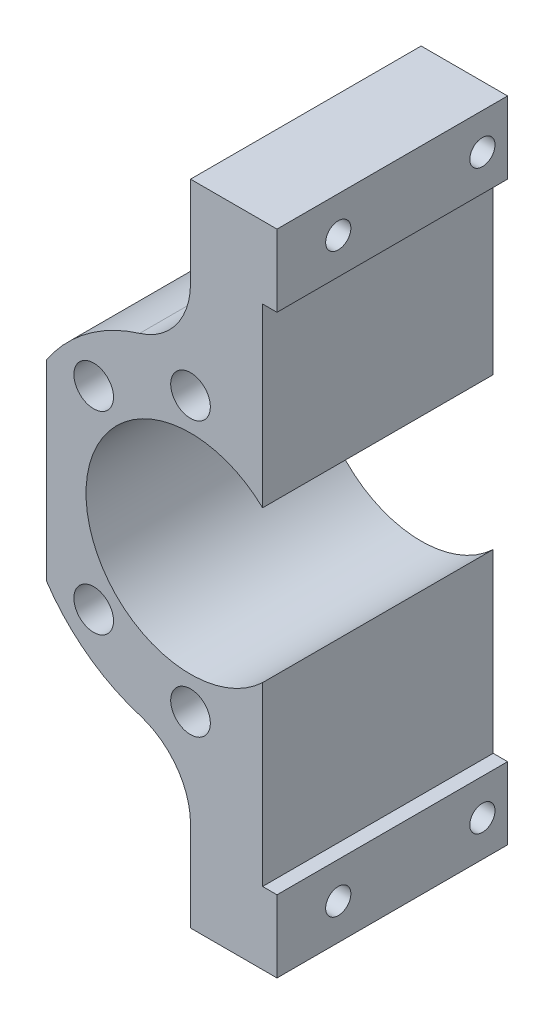
ISO-10303-21;
HEADER;
FILE_DESCRIPTION(('STEP AP214'),'2;1');
FILE_NAME('part.step','',(''),(''),'','','');
FILE_SCHEMA(('AUTOMOTIVE_DESIGN { 1 0 10303 214 1 1 1 1 }'));
ENDSEC;
DATA;
#1=APPLICATION_CONTEXT('core data for automotive mechanical design processes');
#2=APPLICATION_PROTOCOL_DEFINITION('international standard','automotive_design',2000,#1);
#3=PRODUCT_CONTEXT('',#1,'mechanical');
#4=PRODUCT('Part','Part','',(#3));
#5=PRODUCT_RELATED_PRODUCT_CATEGORY('part','',(#4));
#6=PRODUCT_DEFINITION_FORMATION('','',#4);
#7=PRODUCT_DEFINITION_CONTEXT('part definition',#1,'design');
#8=PRODUCT_DEFINITION('design','',#6,#7);
#9=PRODUCT_DEFINITION_SHAPE('','',#8);
#10=(LENGTH_UNIT() NAMED_UNIT(*) SI_UNIT(.MILLI.,.METRE.));
#11=(NAMED_UNIT(*) PLANE_ANGLE_UNIT() SI_UNIT($,.RADIAN.));
#12=(NAMED_UNIT(*) SI_UNIT($,.STERADIAN.) SOLID_ANGLE_UNIT());
#13=UNCERTAINTY_MEASURE_WITH_UNIT(LENGTH_MEASURE(1.E-05),#10,'distance_accuracy_value','');
#14=(GEOMETRIC_REPRESENTATION_CONTEXT(3) GLOBAL_UNCERTAINTY_ASSIGNED_CONTEXT((#13)) GLOBAL_UNIT_ASSIGNED_CONTEXT((#10,
#11,#12)) REPRESENTATION_CONTEXT('',''));
#15=CARTESIAN_POINT('',(0.,0.,0.));
#16=DIRECTION('',(0.,0.,1.));
#17=DIRECTION('',(1.,0.,0.));
#18=AXIS2_PLACEMENT_3D('',#15,#16,#17);
#19=CARTESIAN_POINT('',(7.61347886785544,-11.7092581325979,32.));
#20=DIRECTION('',(-1.,0.,0.));
#21=DIRECTION('',(0.,-1.,0.));
#22=AXIS2_PLACEMENT_3D('',#19,#20,#21);
#23=PLANE('',#22);
#24=DIRECTION('',(0.,0.,1.));
#25=VECTOR('',#24,1.);
#26=CARTESIAN_POINT('',(7.61347886785544,-36.2092581325979,32.));
#27=LINE('',#26,#25);
#28=CARTESIAN_POINT('',(7.61347886785544,-36.2092581325979,0.));
#29=VERTEX_POINT('',#28);
#30=CARTESIAN_POINT('',(7.61347886785544,-36.2092581325979,32.));
#31=VERTEX_POINT('',#30);
#32=EDGE_CURVE('E184',#29,#31,#27,.T.);
#33=ORIENTED_EDGE('',*,*,#32,.F.);
#34=DIRECTION('',(0.,1.,0.));
#35=VECTOR('',#34,1.);
#36=CARTESIAN_POINT('',(7.61347886785544,-11.7092581325979,0.));
#37=LINE('',#36,#35);
#38=CARTESIAN_POINT('',(7.61347886785544,-11.7092581325979,0.));
#39=VERTEX_POINT('',#38);
#40=EDGE_CURVE('E345',#29,#39,#37,.T.);
#41=ORIENTED_EDGE('',*,*,#40,.T.);
#42=DIRECTION('',(0.,0.,-1.));
#43=VECTOR('',#42,1.);
#44=CARTESIAN_POINT('',(7.61347886785544,-11.7092581325979,32.));
#45=LINE('',#44,#43);
#46=CARTESIAN_POINT('',(7.61347886785544,-11.7092581325979,32.));
#47=VERTEX_POINT('',#46);
#48=EDGE_CURVE('E356',#47,#39,#45,.T.);
#49=ORIENTED_EDGE('',*,*,#48,.F.);
#50=DIRECTION('',(0.,1.,0.));
#51=VECTOR('',#50,1.);
#52=CARTESIAN_POINT('',(7.61347886785544,-11.7092581325979,32.));
#53=LINE('',#52,#51);
#54=EDGE_CURVE('E325',#31,#47,#53,.T.);
#55=ORIENTED_EDGE('',*,*,#54,.F.);
#56=EDGE_LOOP('',(#33,#41,#49,#55));
#57=FACE_BOUND('',#56,.T.);
#58=ADVANCED_FACE('F41',(#57),#23,.F.);
#59=CARTESIAN_POINT('',(7.61347886785543,9.29074186740205,32.));
#60=DIRECTION('',(-1.,0.,0.));
#61=DIRECTION('',(0.,-1.,0.));
#62=AXIS2_PLACEMENT_3D('',#59,#60,#61);
#63=PLANE('',#62);
#64=DIRECTION('',(0.,0.,-1.));
#65=VECTOR('',#64,1.);
#66=CARTESIAN_POINT('',(7.61347886785543,33.790741867402,32.));
#67=LINE('',#66,#65);
#68=CARTESIAN_POINT('',(7.61347886785543,33.790741867402,32.));
#69=VERTEX_POINT('',#68);
#70=CARTESIAN_POINT('',(7.61347886785543,33.790741867402,0.));
#71=VERTEX_POINT('',#70);
#72=EDGE_CURVE('E212',#69,#71,#67,.T.);
#73=ORIENTED_EDGE('',*,*,#72,.F.);
#74=DIRECTION('',(0.,1.,0.));
#75=VECTOR('',#74,1.);
#76=CARTESIAN_POINT('',(7.61347886785543,9.29074186740205,32.));
#77=LINE('',#76,#75);
#78=CARTESIAN_POINT('',(7.61347886785543,9.29074186740205,32.));
#79=VERTEX_POINT('',#78);
#80=EDGE_CURVE('E331',#79,#69,#77,.T.);
#81=ORIENTED_EDGE('',*,*,#80,.F.);
#82=DIRECTION('',(0.,0.,-1.));
#83=VECTOR('',#82,1.);
#84=CARTESIAN_POINT('',(7.61347886785543,9.29074186740205,32.));
#85=LINE('',#84,#83);
#86=CARTESIAN_POINT('',(7.61347886785543,9.29074186740205,0.));
#87=VERTEX_POINT('',#86);
#88=EDGE_CURVE('E335',#79,#87,#85,.T.);
#89=ORIENTED_EDGE('',*,*,#88,.T.);
#90=DIRECTION('',(0.,1.,0.));
#91=VECTOR('',#90,1.);
#92=CARTESIAN_POINT('',(7.61347886785543,9.29074186740205,0.));
#93=LINE('',#92,#91);
#94=EDGE_CURVE('E318',#87,#71,#93,.T.);
#95=ORIENTED_EDGE('',*,*,#94,.T.);
#96=EDGE_LOOP('',(#73,#81,#89,#95));
#97=FACE_BOUND('',#96,.T.);
#98=ADVANCED_FACE('F432',(#97),#63,.F.);
#99=CARTESIAN_POINT('',(-2.38652113214456,-1.20925813259795,32.));
#100=DIRECTION('',(0.,0.,-1.));
#101=DIRECTION('',(-1.,0.,0.));
#102=AXIS2_PLACEMENT_3D('',#99,#100,#101);
#103=PLANE('',#102);
#104=DIRECTION('',(0.,-1.,0.));
#105=VECTOR('',#104,1.);
#106=CARTESIAN_POINT('',(-2.38652113214456,22.790741867402,32.));
#107=LINE('',#106,#105);
#108=CARTESIAN_POINT('',(-2.38652113214457,43.790741867402,32.));
#109=VERTEX_POINT('',#108);
#110=CARTESIAN_POINT('',(-2.38652113214456,31.2868954859459,32.));
#111=VERTEX_POINT('',#110);
#112=EDGE_CURVE('E251',#109,#111,#107,.T.);
#113=ORIENTED_EDGE('',*,*,#112,.T.);
#114=CARTESIAN_POINT('',(-12.3865211321446,31.2868954859459,32.));
#115=DIRECTION('',(0.,0.,-1.));
#116=DIRECTION('',(-1.,0.,0.));
#117=AXIS2_PLACEMENT_3D('',#114,#115,#116);
#118=CIRCLE('',#117,10.);
#119=CARTESIAN_POINT('',(-9.44534466155633,21.7292032451977,32.));
#120=VERTEX_POINT('',#119);
#121=EDGE_CURVE('E11',#111,#120,#118,.T.);
#122=ORIENTED_EDGE('',*,*,#121,.T.);
#123=CARTESIAN_POINT('',(-2.38652113214456,-1.20925813259795,32.));
#124=DIRECTION('',(0.,0.,1.));
#125=DIRECTION('',(-1.,0.,0.));
#126=AXIS2_PLACEMENT_3D('',#123,#124,#125);
#127=CIRCLE('',#126,24.);
#128=CARTESIAN_POINT('',(-22.3865211321446,12.0572410288236,32.));
#129=VERTEX_POINT('',#128);
#130=EDGE_CURVE('E314',#120,#129,#127,.T.);
#131=ORIENTED_EDGE('',*,*,#130,.T.);
#132=DIRECTION('',(0.,-1.,0.));
#133=VECTOR('',#132,1.);
#134=CARTESIAN_POINT('',(-22.3865211321446,12.0572410288236,32.));
#135=LINE('',#134,#133);
#136=CARTESIAN_POINT('',(-22.3865211321446,-14.4757572940195,32.));
#137=VERTEX_POINT('',#136);
#138=EDGE_CURVE('E317',#129,#137,#135,.T.);
#139=ORIENTED_EDGE('',*,*,#138,.T.);
#140=CARTESIAN_POINT('',(-2.38652113214456,-1.20925813259795,32.));
#141=DIRECTION('',(0.,0.,1.));
#142=DIRECTION('',(1.,0.,0.));
#143=AXIS2_PLACEMENT_3D('',#140,#141,#142);
#144=CIRCLE('',#143,24.);
#145=CARTESIAN_POINT('',(-9.44534466155632,-24.1477195103936,32.));
#146=VERTEX_POINT('',#145);
#147=EDGE_CURVE('E321',#137,#146,#144,.T.);
#148=ORIENTED_EDGE('',*,*,#147,.T.);
#149=CARTESIAN_POINT('',(-12.3865211321446,-33.7054117511418,32.));
#150=DIRECTION('',(0.,0.,-1.));
#151=DIRECTION('',(-1.,0.,0.));
#152=AXIS2_PLACEMENT_3D('',#149,#150,#151);
#153=CIRCLE('',#152,10.);
#154=CARTESIAN_POINT('',(-2.38652113214456,-33.7054117511418,32.));
#155=VERTEX_POINT('',#154);
#156=EDGE_CURVE('E384',#146,#155,#153,.T.);
#157=ORIENTED_EDGE('',*,*,#156,.T.);
#158=DIRECTION('',(0.,-1.,0.));
#159=VECTOR('',#158,1.);
#160=CARTESIAN_POINT('',(-2.38652113214456,-25.209258132598,32.));
#161=LINE('',#160,#159);
#162=CARTESIAN_POINT('',(-2.38652113214455,-46.209258132598,32.));
#163=VERTEX_POINT('',#162);
#164=EDGE_CURVE('E162',#155,#163,#161,.T.);
#165=ORIENTED_EDGE('',*,*,#164,.T.);
#166=DIRECTION('',(1.,0.,0.));
#167=VECTOR('',#166,1.);
#168=CARTESIAN_POINT('',(-2.38652113214455,-46.209258132598,32.));
#169=LINE('',#168,#167);
#170=CARTESIAN_POINT('',(9.61347886785544,-46.209258132598,32.));
#171=VERTEX_POINT('',#170);
#172=EDGE_CURVE('E154',#163,#171,#169,.T.);
#173=ORIENTED_EDGE('',*,*,#172,.T.);
#174=DIRECTION('',(0.,-1.,0.));
#175=VECTOR('',#174,1.);
#176=CARTESIAN_POINT('',(9.61347886785544,-46.209258132598,32.));
#177=LINE('',#176,#175);
#178=CARTESIAN_POINT('',(9.61347886785544,-36.2092581325979,32.));
#179=VERTEX_POINT('',#178);
#180=EDGE_CURVE('E160',#179,#171,#177,.T.);
#181=ORIENTED_EDGE('',*,*,#180,.F.);
#182=DIRECTION('',(-1.,0.,0.));
#183=VECTOR('',#182,1.);
#184=CARTESIAN_POINT('',(9.61347886785544,-36.2092581325979,32.));
#185=LINE('',#184,#183);
#186=EDGE_CURVE('E196',#179,#31,#185,.T.);
#187=ORIENTED_EDGE('',*,*,#186,.T.);
#188=ORIENTED_EDGE('',*,*,#54,.T.);
#189=CARTESIAN_POINT('',(-2.38652113214456,-1.20925813259795,32.));
#190=DIRECTION('',(0.,0.,-1.));
#191=DIRECTION('',(-1.,0.,0.));
#192=AXIS2_PLACEMENT_3D('',#189,#190,#191);
#193=CIRCLE('',#192,14.5);
#194=EDGE_CURVE('E328',#47,#79,#193,.T.);
#195=ORIENTED_EDGE('',*,*,#194,.T.);
#196=ORIENTED_EDGE('',*,*,#80,.T.);
#197=DIRECTION('',(-1.,0.,0.));
#198=VECTOR('',#197,1.);
#199=CARTESIAN_POINT('',(9.61347886785543,33.790741867402,32.));
#200=LINE('',#199,#198);
#201=CARTESIAN_POINT('',(9.61347886785543,33.790741867402,32.));
#202=VERTEX_POINT('',#201);
#203=EDGE_CURVE('E235',#202,#69,#200,.T.);
#204=ORIENTED_EDGE('',*,*,#203,.F.);
#205=DIRECTION('',(0.,-1.,0.));
#206=VECTOR('',#205,1.);
#207=CARTESIAN_POINT('',(9.61347886785543,43.790741867402,32.));
#208=LINE('',#207,#206);
#209=CARTESIAN_POINT('',(9.61347886785543,43.790741867402,32.));
#210=VERTEX_POINT('',#209);
#211=EDGE_CURVE('E213',#210,#202,#208,.T.);
#212=ORIENTED_EDGE('',*,*,#211,.F.);
#213=DIRECTION('',(1.,0.,0.));
#214=VECTOR('',#213,1.);
#215=CARTESIAN_POINT('',(-2.38652113214457,43.790741867402,32.));
#216=LINE('',#215,#214);
#217=EDGE_CURVE('E257',#109,#210,#216,.T.);
#218=ORIENTED_EDGE('',*,*,#217,.F.);
#219=EDGE_LOOP('',(#113,#122,#131,#139,#148,#157,#165,#173,#181,#187,#188,#195,#196,#204,#212,#218));
#220=FACE_BOUND('',#219,.T.);
#221=CARTESIAN_POINT('',(-2.38652113214456,17.7907418674021,32.));
#222=DIRECTION('',(0.,0.,1.));
#223=DIRECTION('',(1.,0.,0.));
#224=AXIS2_PLACEMENT_3D('',#221,#222,#223);
#225=CIRCLE('',#224,2.75);
#226=CARTESIAN_POINT('',(0.363478867855439,17.7907418674021,32.));
#227=VERTEX_POINT('',#226);
#228=EDGE_CURVE('E306',#227,#227,#225,.T.);
#229=ORIENTED_EDGE('',*,*,#228,.F.);
#230=EDGE_LOOP('',(#229));
#231=FACE_BOUND('',#230,.T.);
#232=CARTESIAN_POINT('',(-15.821549974689,12.2257707099464,32.));
#233=DIRECTION('',(0.,0.,1.));
#234=DIRECTION('',(1.,0.,0.));
#235=AXIS2_PLACEMENT_3D('',#232,#233,#234);
#236=CIRCLE('',#235,2.75);
#237=CARTESIAN_POINT('',(-13.071549974689,12.2257707099464,32.));
#238=VERTEX_POINT('',#237);
#239=EDGE_CURVE('E298',#238,#238,#236,.T.);
#240=ORIENTED_EDGE('',*,*,#239,.F.);
#241=EDGE_LOOP('',(#240));
#242=FACE_BOUND('',#241,.T.);
#243=CARTESIAN_POINT('',(-2.38652113214456,-20.2092581325979,32.));
#244=DIRECTION('',(0.,0.,1.));
#245=DIRECTION('',(1.,0.,0.));
#246=AXIS2_PLACEMENT_3D('',#243,#244,#245);
#247=CIRCLE('',#246,2.75);
#248=CARTESIAN_POINT('',(0.363478867855441,-20.2092581325979,32.));
#249=VERTEX_POINT('',#248);
#250=EDGE_CURVE('E290',#249,#249,#247,.T.);
#251=ORIENTED_EDGE('',*,*,#250,.F.);
#252=EDGE_LOOP('',(#251));
#253=FACE_BOUND('',#252,.T.);
#254=CARTESIAN_POINT('',(-15.821549974689,-14.6442869751423,32.));
#255=DIRECTION('',(0.,0.,1.));
#256=DIRECTION('',(1.,0.,0.));
#257=AXIS2_PLACEMENT_3D('',#254,#255,#256);
#258=CIRCLE('',#257,2.75);
#259=CARTESIAN_POINT('',(-13.071549974689,-14.6442869751423,32.));
#260=VERTEX_POINT('',#259);
#261=EDGE_CURVE('E282',#260,#260,#258,.T.);
#262=ORIENTED_EDGE('',*,*,#261,.F.);
#263=EDGE_LOOP('',(#262));
#264=FACE_BOUND('',#263,.T.);
#265=ADVANCED_FACE('F156',(#220,#231,#242,#253,#264),#103,.F.);
#266=CARTESIAN_POINT('',(-2.38652113214456,-1.20925813259795,0.));
#267=DIRECTION('',(0.,0.,-1.));
#268=DIRECTION('',(-1.,0.,0.));
#269=AXIS2_PLACEMENT_3D('',#266,#267,#268);
#270=PLANE('',#269);
#271=CARTESIAN_POINT('',(-2.38652113214456,-20.2092581325979,0.));
#272=DIRECTION('',(0.,0.,1.));
#273=DIRECTION('',(1.,0.,0.));
#274=AXIS2_PLACEMENT_3D('',#271,#272,#273);
#275=CIRCLE('',#274,2.75);
#276=CARTESIAN_POINT('',(0.363478867855441,-20.2092581325979,0.));
#277=VERTEX_POINT('',#276);
#278=EDGE_CURVE('E286',#277,#277,#275,.T.);
#279=ORIENTED_EDGE('',*,*,#278,.T.);
#280=EDGE_LOOP('',(#279));
#281=FACE_BOUND('',#280,.T.);
#282=CARTESIAN_POINT('',(-2.38652113214456,17.7907418674021,0.));
#283=DIRECTION('',(0.,0.,1.));
#284=DIRECTION('',(1.,0.,0.));
#285=AXIS2_PLACEMENT_3D('',#282,#283,#284);
#286=CIRCLE('',#285,2.75);
#287=CARTESIAN_POINT('',(0.363478867855439,17.7907418674021,0.));
#288=VERTEX_POINT('',#287);
#289=EDGE_CURVE('E302',#288,#288,#286,.T.);
#290=ORIENTED_EDGE('',*,*,#289,.T.);
#291=EDGE_LOOP('',(#290));
#292=FACE_BOUND('',#291,.T.);
#293=CARTESIAN_POINT('',(-2.38652113214456,-1.20925813259795,0.));
#294=DIRECTION('',(0.,0.,1.));
#295=DIRECTION('',(-1.,0.,0.));
#296=AXIS2_PLACEMENT_3D('',#293,#294,#295);
#297=CIRCLE('',#296,24.);
#298=CARTESIAN_POINT('',(-9.44534466155633,21.7292032451977,0.));
#299=VERTEX_POINT('',#298);
#300=CARTESIAN_POINT('',(-22.3865211321446,12.0572410288236,0.));
#301=VERTEX_POINT('',#300);
#302=EDGE_CURVE('E310',#299,#301,#297,.T.);
#303=ORIENTED_EDGE('',*,*,#302,.F.);
#304=CARTESIAN_POINT('',(-12.3865211321446,31.2868954859459,0.));
#305=DIRECTION('',(0.,0.,-1.));
#306=DIRECTION('',(-1.,0.,0.));
#307=AXIS2_PLACEMENT_3D('',#304,#305,#306);
#308=CIRCLE('',#307,10.);
#309=CARTESIAN_POINT('',(-2.38652113214456,31.2868954859459,0.));
#310=VERTEX_POINT('',#309);
#311=EDGE_CURVE('E50',#299,#310,#308,.F.);
#312=ORIENTED_EDGE('',*,*,#311,.T.);
#313=DIRECTION('',(0.,1.,0.));
#314=VECTOR('',#313,1.);
#315=CARTESIAN_POINT('',(-2.38652113214457,43.790741867402,0.));
#316=LINE('',#315,#314);
#317=CARTESIAN_POINT('',(-2.38652113214457,43.790741867402,0.));
#318=VERTEX_POINT('',#317);
#319=EDGE_CURVE('E254',#310,#318,#316,.T.);
#320=ORIENTED_EDGE('',*,*,#319,.T.);
#321=DIRECTION('',(1.,0.,0.));
#322=VECTOR('',#321,1.);
#323=CARTESIAN_POINT('',(-2.38652113214457,43.790741867402,0.));
#324=LINE('',#323,#322);
#325=CARTESIAN_POINT('',(9.61347886785543,43.790741867402,0.));
#326=VERTEX_POINT('',#325);
#327=EDGE_CURVE('E258',#318,#326,#324,.T.);
#328=ORIENTED_EDGE('',*,*,#327,.T.);
#329=DIRECTION('',(0.,1.,0.));
#330=VECTOR('',#329,1.);
#331=CARTESIAN_POINT('',(9.61347886785543,43.790741867402,0.));
#332=LINE('',#331,#330);
#333=CARTESIAN_POINT('',(9.61347886785543,33.790741867402,0.));
#334=VERTEX_POINT('',#333);
#335=EDGE_CURVE('E220',#334,#326,#332,.T.);
#336=ORIENTED_EDGE('',*,*,#335,.F.);
#337=DIRECTION('',(-1.,0.,0.));
#338=VECTOR('',#337,1.);
#339=CARTESIAN_POINT('',(9.61347886785543,33.790741867402,0.));
#340=LINE('',#339,#338);
#341=EDGE_CURVE('E228',#334,#71,#340,.T.);
#342=ORIENTED_EDGE('',*,*,#341,.T.);
#343=ORIENTED_EDGE('',*,*,#94,.F.);
#344=CARTESIAN_POINT('',(-2.38652113214456,-1.20925813259795,0.));
#345=DIRECTION('',(0.,0.,-1.));
#346=DIRECTION('',(-1.,0.,0.));
#347=AXIS2_PLACEMENT_3D('',#344,#345,#346);
#348=CIRCLE('',#347,14.5);
#349=EDGE_CURVE('E348',#39,#87,#348,.T.);
#350=ORIENTED_EDGE('',*,*,#349,.F.);
#351=ORIENTED_EDGE('',*,*,#40,.F.);
#352=DIRECTION('',(-1.,0.,0.));
#353=VECTOR('',#352,1.);
#354=CARTESIAN_POINT('',(9.61347886785544,-36.2092581325979,0.));
#355=LINE('',#354,#353);
#356=CARTESIAN_POINT('',(9.61347886785544,-36.2092581325979,0.));
#357=VERTEX_POINT('',#356);
#358=EDGE_CURVE('E200',#357,#29,#355,.T.);
#359=ORIENTED_EDGE('',*,*,#358,.F.);
#360=DIRECTION('',(0.,1.,0.));
#361=VECTOR('',#360,1.);
#362=CARTESIAN_POINT('',(9.61347886785544,-46.209258132598,0.));
#363=LINE('',#362,#361);
#364=CARTESIAN_POINT('',(9.61347886785544,-46.209258132598,0.));
#365=VERTEX_POINT('',#364);
#366=EDGE_CURVE('E176',#365,#357,#363,.T.);
#367=ORIENTED_EDGE('',*,*,#366,.F.);
#368=DIRECTION('',(1.,0.,0.));
#369=VECTOR('',#368,1.);
#370=CARTESIAN_POINT('',(-2.38652113214455,-46.209258132598,0.));
#371=LINE('',#370,#369);
#372=CARTESIAN_POINT('',(-2.38652113214455,-46.209258132598,0.));
#373=VERTEX_POINT('',#372);
#374=EDGE_CURVE('E167',#373,#365,#371,.T.);
#375=ORIENTED_EDGE('',*,*,#374,.F.);
#376=DIRECTION('',(0.,1.,0.));
#377=VECTOR('',#376,1.);
#378=CARTESIAN_POINT('',(-2.38652113214456,-25.209258132598,0.));
#379=LINE('',#378,#377);
#380=CARTESIAN_POINT('',(-2.38652113214456,-33.7054117511418,0.));
#381=VERTEX_POINT('',#380);
#382=EDGE_CURVE('E168',#373,#381,#379,.T.);
#383=ORIENTED_EDGE('',*,*,#382,.T.);
#384=CARTESIAN_POINT('',(-12.3865211321446,-33.7054117511418,0.));
#385=DIRECTION('',(0.,0.,-1.));
#386=DIRECTION('',(-1.,0.,0.));
#387=AXIS2_PLACEMENT_3D('',#384,#385,#386);
#388=CIRCLE('',#387,10.);
#389=CARTESIAN_POINT('',(-9.44534466155632,-24.1477195103936,0.));
#390=VERTEX_POINT('',#389);
#391=EDGE_CURVE('E381',#381,#390,#388,.F.);
#392=ORIENTED_EDGE('',*,*,#391,.T.);
#393=CARTESIAN_POINT('',(-2.38652113214456,-1.20925813259795,0.));
#394=DIRECTION('',(0.,0.,1.));
#395=DIRECTION('',(1.,0.,0.));
#396=AXIS2_PLACEMENT_3D('',#393,#394,#395);
#397=CIRCLE('',#396,24.);
#398=CARTESIAN_POINT('',(-22.3865211321446,-14.4757572940195,0.));
#399=VERTEX_POINT('',#398);
#400=EDGE_CURVE('E341',#399,#390,#397,.T.);
#401=ORIENTED_EDGE('',*,*,#400,.F.);
#402=DIRECTION('',(0.,-1.,0.));
#403=VECTOR('',#402,1.);
#404=CARTESIAN_POINT('',(-22.3865211321446,12.0572410288236,0.));
#405=LINE('',#404,#403);
#406=EDGE_CURVE('E338',#301,#399,#405,.T.);
#407=ORIENTED_EDGE('',*,*,#406,.F.);
#408=EDGE_LOOP('',(#303,#312,#320,#328,#336,#342,#343,#350,#351,#359,#367,#375,#383,#392,#401,#407));
#409=FACE_BOUND('',#408,.T.);
#410=CARTESIAN_POINT('',(-15.821549974689,12.2257707099464,0.));
#411=DIRECTION('',(0.,0.,1.));
#412=DIRECTION('',(1.,0.,0.));
#413=AXIS2_PLACEMENT_3D('',#410,#411,#412);
#414=CIRCLE('',#413,2.75);
#415=CARTESIAN_POINT('',(-13.071549974689,12.2257707099464,0.));
#416=VERTEX_POINT('',#415);
#417=EDGE_CURVE('E294',#416,#416,#414,.T.);
#418=ORIENTED_EDGE('',*,*,#417,.T.);
#419=EDGE_LOOP('',(#418));
#420=FACE_BOUND('',#419,.T.);
#421=CARTESIAN_POINT('',(-15.821549974689,-14.6442869751423,0.));
#422=DIRECTION('',(0.,0.,1.));
#423=DIRECTION('',(1.,0.,0.));
#424=AXIS2_PLACEMENT_3D('',#421,#422,#423);
#425=CIRCLE('',#424,2.75);
#426=CARTESIAN_POINT('',(-13.071549974689,-14.6442869751423,0.));
#427=VERTEX_POINT('',#426);
#428=EDGE_CURVE('E280',#427,#427,#425,.T.);
#429=ORIENTED_EDGE('',*,*,#428,.T.);
#430=EDGE_LOOP('',(#429));
#431=FACE_BOUND('',#430,.T.);
#432=ADVANCED_FACE('F397',(#281,#292,#409,#420,#431),#270,.T.);
#433=CARTESIAN_POINT('',(-2.38652113214456,-1.20925813259795,32.));
#434=DIRECTION('',(0.,0.,-1.));
#435=DIRECTION('',(-1.,0.,0.));
#436=AXIS2_PLACEMENT_3D('',#433,#434,#435);
#437=CYLINDRICAL_SURFACE('',#436,24.);
#438=ORIENTED_EDGE('',*,*,#130,.F.);
#439=DIRECTION('',(0.,0.,-1.));
#440=VECTOR('',#439,1.);
#441=CARTESIAN_POINT('',(-9.44534466155633,21.7292032451977,32.));
#442=LINE('',#441,#440);
#443=EDGE_CURVE('E375',#120,#299,#442,.T.);
#444=ORIENTED_EDGE('',*,*,#443,.T.);
#445=ORIENTED_EDGE('',*,*,#302,.T.);
#446=DIRECTION('',(0.,0.,-1.));
#447=VECTOR('',#446,1.);
#448=CARTESIAN_POINT('',(-22.3865211321446,12.0572410288236,32.));
#449=LINE('',#448,#447);
#450=EDGE_CURVE('E364',#129,#301,#449,.T.);
#451=ORIENTED_EDGE('',*,*,#450,.F.);
#452=EDGE_LOOP('',(#438,#444,#445,#451));
#453=FACE_BOUND('',#452,.T.);
#454=ADVANCED_FACE('F409',(#453),#437,.T.);
#455=CARTESIAN_POINT('',(-22.3865211321446,12.0572410288236,32.));
#456=DIRECTION('',(1.,0.,0.));
#457=DIRECTION('',(0.,1.,0.));
#458=AXIS2_PLACEMENT_3D('',#455,#456,#457);
#459=PLANE('',#458);
#460=ORIENTED_EDGE('',*,*,#406,.T.);
#461=DIRECTION('',(0.,0.,-1.));
#462=VECTOR('',#461,1.);
#463=CARTESIAN_POINT('',(-22.3865211321446,-14.4757572940195,32.));
#464=LINE('',#463,#462);
#465=EDGE_CURVE('E360',#137,#399,#464,.T.);
#466=ORIENTED_EDGE('',*,*,#465,.F.);
#467=ORIENTED_EDGE('',*,*,#138,.F.);
#468=ORIENTED_EDGE('',*,*,#450,.T.);
#469=EDGE_LOOP('',(#460,#466,#467,#468));
#470=FACE_BOUND('',#469,.T.);
#471=ADVANCED_FACE('F405',(#470),#459,.F.);
#472=CARTESIAN_POINT('',(-2.38652113214456,-1.20925813259795,32.));
#473=DIRECTION('',(0.,0.,-1.));
#474=DIRECTION('',(-1.,0.,0.));
#475=AXIS2_PLACEMENT_3D('',#472,#473,#474);
#476=CYLINDRICAL_SURFACE('',#475,24.);
#477=ORIENTED_EDGE('',*,*,#400,.T.);
#478=DIRECTION('',(0.,0.,-1.));
#479=VECTOR('',#478,1.);
#480=CARTESIAN_POINT('',(-9.44534466155632,-24.1477195103936,32.));
#481=LINE('',#480,#479);
#482=EDGE_CURVE('E372',#390,#146,#481,.F.);
#483=ORIENTED_EDGE('',*,*,#482,.T.);
#484=ORIENTED_EDGE('',*,*,#147,.F.);
#485=ORIENTED_EDGE('',*,*,#465,.T.);
#486=EDGE_LOOP('',(#477,#483,#484,#485));
#487=FACE_BOUND('',#486,.T.);
#488=ADVANCED_FACE('F401',(#487),#476,.T.);
#489=CARTESIAN_POINT('',(-2.38652113214456,-1.20925813259795,32.));
#490=DIRECTION('',(0.,0.,-1.));
#491=DIRECTION('',(-1.,0.,0.));
#492=AXIS2_PLACEMENT_3D('',#489,#490,#491);
#493=CYLINDRICAL_SURFACE('',#492,14.5);
#494=ORIENTED_EDGE('',*,*,#349,.T.);
#495=ORIENTED_EDGE('',*,*,#88,.F.);
#496=ORIENTED_EDGE('',*,*,#194,.F.);
#497=ORIENTED_EDGE('',*,*,#48,.T.);
#498=EDGE_LOOP('',(#494,#495,#496,#497));
#499=FACE_BOUND('',#498,.T.);
#500=ADVANCED_FACE('F437',(#499),#493,.F.);
#501=CARTESIAN_POINT('',(-2.38652113214456,17.7907418674021,32.));
#502=DIRECTION('',(0.,0.,-1.));
#503=DIRECTION('',(-1.,0.,0.));
#504=AXIS2_PLACEMENT_3D('',#501,#502,#503);
#505=CYLINDRICAL_SURFACE('',#504,2.75);
#506=ORIENTED_EDGE('',*,*,#228,.T.);
#507=EDGE_LOOP('',(#506));
#508=FACE_BOUND('',#507,.T.);
#509=ORIENTED_EDGE('',*,*,#289,.F.);
#510=EDGE_LOOP('',(#509));
#511=FACE_BOUND('',#510,.T.);
#512=ADVANCED_FACE('F475',(#508,#511),#505,.F.);
#513=CARTESIAN_POINT('',(-15.821549974689,12.2257707099464,32.));
#514=DIRECTION('',(0.,0.,-1.));
#515=DIRECTION('',(-1.,0.,0.));
#516=AXIS2_PLACEMENT_3D('',#513,#514,#515);
#517=CYLINDRICAL_SURFACE('',#516,2.75);
#518=ORIENTED_EDGE('',*,*,#239,.T.);
#519=EDGE_LOOP('',(#518));
#520=FACE_BOUND('',#519,.T.);
#521=ORIENTED_EDGE('',*,*,#417,.F.);
#522=EDGE_LOOP('',(#521));
#523=FACE_BOUND('',#522,.T.);
#524=ADVANCED_FACE('F478',(#520,#523),#517,.F.);
#525=CARTESIAN_POINT('',(-2.38652113214456,-20.2092581325979,32.));
#526=DIRECTION('',(0.,0.,-1.));
#527=DIRECTION('',(-1.,0.,0.));
#528=AXIS2_PLACEMENT_3D('',#525,#526,#527);
#529=CYLINDRICAL_SURFACE('',#528,2.75);
#530=ORIENTED_EDGE('',*,*,#250,.T.);
#531=EDGE_LOOP('',(#530));
#532=FACE_BOUND('',#531,.T.);
#533=ORIENTED_EDGE('',*,*,#278,.F.);
#534=EDGE_LOOP('',(#533));
#535=FACE_BOUND('',#534,.T.);
#536=ADVANCED_FACE('F482',(#532,#535),#529,.F.);
#537=CARTESIAN_POINT('',(-15.821549974689,-14.6442869751423,32.));
#538=DIRECTION('',(0.,0.,-1.));
#539=DIRECTION('',(-1.,0.,0.));
#540=AXIS2_PLACEMENT_3D('',#537,#538,#539);
#541=CYLINDRICAL_SURFACE('',#540,2.75);
#542=ORIENTED_EDGE('',*,*,#261,.T.);
#543=EDGE_LOOP('',(#542));
#544=FACE_BOUND('',#543,.T.);
#545=ORIENTED_EDGE('',*,*,#428,.F.);
#546=EDGE_LOOP('',(#545));
#547=FACE_BOUND('',#546,.T.);
#548=ADVANCED_FACE('F486',(#544,#547),#541,.F.);
#549=CARTESIAN_POINT('',(-2.38652113214455,-46.209258132598,32.));
#550=DIRECTION('',(0.,-1.,0.));
#551=DIRECTION('',(1.,0.,0.));
#552=AXIS2_PLACEMENT_3D('',#549,#550,#551);
#553=PLANE('',#552);
#554=ORIENTED_EDGE('',*,*,#374,.T.);
#555=DIRECTION('',(0.,0.,-1.));
#556=VECTOR('',#555,1.);
#557=CARTESIAN_POINT('',(9.61347886785544,-46.209258132598,32.));
#558=LINE('',#557,#556);
#559=EDGE_CURVE('E171',#171,#365,#558,.T.);
#560=ORIENTED_EDGE('',*,*,#559,.F.);
#561=ORIENTED_EDGE('',*,*,#172,.F.);
#562=DIRECTION('',(0.,0.,-1.));
#563=VECTOR('',#562,1.);
#564=CARTESIAN_POINT('',(-2.38652113214455,-46.209258132598,32.));
#565=LINE('',#564,#563);
#566=EDGE_CURVE('E273',#163,#373,#565,.T.);
#567=ORIENTED_EDGE('',*,*,#566,.T.);
#568=EDGE_LOOP('',(#554,#560,#561,#567));
#569=FACE_BOUND('',#568,.T.);
#570=ADVANCED_FACE('F172',(#569),#553,.T.);
#571=CARTESIAN_POINT('',(-2.38652113214456,0.,0.));
#572=DIRECTION('',(1.,0.,0.));
#573=DIRECTION('',(0.,1.,0.));
#574=AXIS2_PLACEMENT_3D('',#571,#572,#573);
#575=PLANE('',#574);
#576=CARTESIAN_POINT('',(-2.38652113214456,-41.209258132598,3.5));
#577=DIRECTION('',(1.,0.,0.));
#578=DIRECTION('',(0.,1.,0.));
#579=AXIS2_PLACEMENT_3D('',#576,#577,#578);
#580=CIRCLE('',#579,1.75);
#581=CARTESIAN_POINT('',(-2.38652113214456,-39.459258132598,3.5));
#582=VERTEX_POINT('',#581);
#583=EDGE_CURVE('E261',#582,#582,#580,.T.);
#584=ORIENTED_EDGE('',*,*,#583,.T.);
#585=EDGE_LOOP('',(#584));
#586=FACE_BOUND('',#585,.T.);
#587=CARTESIAN_POINT('',(-2.38652113214456,-41.209258132598,23.5));
#588=DIRECTION('',(1.,0.,0.));
#589=DIRECTION('',(0.,1.,0.));
#590=AXIS2_PLACEMENT_3D('',#587,#588,#589);
#591=CIRCLE('',#590,1.75);
#592=CARTESIAN_POINT('',(-2.38652113214456,-39.459258132598,23.5));
#593=VERTEX_POINT('',#592);
#594=EDGE_CURVE('E267',#593,#593,#591,.T.);
#595=ORIENTED_EDGE('',*,*,#594,.T.);
#596=EDGE_LOOP('',(#595));
#597=FACE_BOUND('',#596,.T.);
#598=ORIENTED_EDGE('',*,*,#164,.F.);
#599=DIRECTION('',(0.,0.,1.));
#600=VECTOR('',#599,1.);
#601=CARTESIAN_POINT('',(-2.38652113214456,-33.7054117511418,0.));
#602=LINE('',#601,#600);
#603=EDGE_CURVE('E368',#155,#381,#602,.F.);
#604=ORIENTED_EDGE('',*,*,#603,.T.);
#605=ORIENTED_EDGE('',*,*,#382,.F.);
#606=ORIENTED_EDGE('',*,*,#566,.F.);
#607=EDGE_LOOP('',(#598,#604,#605,#606));
#608=FACE_BOUND('',#607,.T.);
#609=ADVANCED_FACE('F393',(#586,#597,#608),#575,.F.);
#610=CARTESIAN_POINT('',(-2.38652113214456,-41.209258132598,23.5));
#611=DIRECTION('',(1.,0.,0.));
#612=DIRECTION('',(0.,1.,0.));
#613=AXIS2_PLACEMENT_3D('',#610,#611,#612);
#614=CYLINDRICAL_SURFACE('',#613,1.75);
#615=ORIENTED_EDGE('',*,*,#594,.F.);
#616=EDGE_LOOP('',(#615));
#617=FACE_BOUND('',#616,.T.);
#618=CARTESIAN_POINT('',(9.61347886785544,-41.209258132598,23.5));
#619=DIRECTION('',(1.,0.,0.));
#620=DIRECTION('',(0.,1.,0.));
#621=AXIS2_PLACEMENT_3D('',#618,#619,#620);
#622=CIRCLE('',#621,1.75);
#623=CARTESIAN_POINT('',(9.61347886785544,-39.459258132598,23.5));
#624=VERTEX_POINT('',#623);
#625=EDGE_CURVE('E730',#624,#624,#622,.T.);
#626=ORIENTED_EDGE('',*,*,#625,.T.);
#627=EDGE_LOOP('',(#626));
#628=FACE_BOUND('',#627,.T.);
#629=ADVANCED_FACE('F495',(#617,#628),#614,.F.);
#630=CARTESIAN_POINT('',(-2.38652113214456,-41.209258132598,3.5));
#631=DIRECTION('',(1.,0.,0.));
#632=DIRECTION('',(0.,1.,0.));
#633=AXIS2_PLACEMENT_3D('',#630,#631,#632);
#634=CYLINDRICAL_SURFACE('',#633,1.75);
#635=ORIENTED_EDGE('',*,*,#583,.F.);
#636=EDGE_LOOP('',(#635));
#637=FACE_BOUND('',#636,.T.);
#638=CARTESIAN_POINT('',(9.61347886785544,-41.209258132598,3.5));
#639=DIRECTION('',(1.,0.,0.));
#640=DIRECTION('',(0.,1.,0.));
#641=AXIS2_PLACEMENT_3D('',#638,#639,#640);
#642=CIRCLE('',#641,1.75);
#643=CARTESIAN_POINT('',(9.61347886785544,-39.459258132598,3.5));
#644=VERTEX_POINT('',#643);
#645=EDGE_CURVE('E188',#644,#644,#642,.T.);
#646=ORIENTED_EDGE('',*,*,#645,.T.);
#647=EDGE_LOOP('',(#646));
#648=FACE_BOUND('',#647,.T.);
#649=ADVANCED_FACE('F499',(#637,#648),#634,.F.);
#650=CARTESIAN_POINT('',(-2.38652113214457,43.790741867402,32.));
#651=DIRECTION('',(0.,1.,0.));
#652=DIRECTION('',(-1.,0.,0.));
#653=AXIS2_PLACEMENT_3D('',#650,#651,#652);
#654=PLANE('',#653);
#655=ORIENTED_EDGE('',*,*,#217,.T.);
#656=DIRECTION('',(0.,0.,1.));
#657=VECTOR('',#656,1.);
#658=CARTESIAN_POINT('',(9.61347886785543,43.790741867402,32.));
#659=LINE('',#658,#657);
#660=EDGE_CURVE('E224',#326,#210,#659,.T.);
#661=ORIENTED_EDGE('',*,*,#660,.F.);
#662=ORIENTED_EDGE('',*,*,#327,.F.);
#663=DIRECTION('',(0.,0.,1.));
#664=VECTOR('',#663,1.);
#665=CARTESIAN_POINT('',(-2.38652113214457,43.790741867402,32.));
#666=LINE('',#665,#664);
#667=EDGE_CURVE('E247',#318,#109,#666,.T.);
#668=ORIENTED_EDGE('',*,*,#667,.T.);
#669=EDGE_LOOP('',(#655,#661,#662,#668));
#670=FACE_BOUND('',#669,.T.);
#671=ADVANCED_FACE('F418',(#670),#654,.T.);
#672=CARTESIAN_POINT('',(-2.38652113214456,0.,0.));
#673=DIRECTION('',(-1.,0.,0.));
#674=DIRECTION('',(0.,-1.,0.));
#675=AXIS2_PLACEMENT_3D('',#672,#673,#674);
#676=PLANE('',#675);
#677=CARTESIAN_POINT('',(-2.38652113214457,38.790741867402,3.5));
#678=DIRECTION('',(1.,0.,0.));
#679=DIRECTION('',(0.,1.,0.));
#680=AXIS2_PLACEMENT_3D('',#677,#678,#679);
#681=CIRCLE('',#680,1.75);
#682=CARTESIAN_POINT('',(-2.38652113214457,40.540741867402,3.5));
#683=VERTEX_POINT('',#682);
#684=EDGE_CURVE('E239',#683,#683,#681,.T.);
#685=ORIENTED_EDGE('',*,*,#684,.T.);
#686=EDGE_LOOP('',(#685));
#687=FACE_BOUND('',#686,.T.);
#688=CARTESIAN_POINT('',(-2.38652113214457,38.790741867402,23.5));
#689=DIRECTION('',(1.,0.,0.));
#690=DIRECTION('',(0.,1.,0.));
#691=AXIS2_PLACEMENT_3D('',#688,#689,#690);
#692=CIRCLE('',#691,1.75);
#693=CARTESIAN_POINT('',(-2.38652113214457,40.540741867402,23.5));
#694=VERTEX_POINT('',#693);
#695=EDGE_CURVE('E243',#694,#694,#692,.T.);
#696=ORIENTED_EDGE('',*,*,#695,.T.);
#697=EDGE_LOOP('',(#696));
#698=FACE_BOUND('',#697,.T.);
#699=ORIENTED_EDGE('',*,*,#319,.F.);
#700=DIRECTION('',(0.,0.,-1.));
#701=VECTOR('',#700,1.);
#702=CARTESIAN_POINT('',(-2.38652113214456,31.2868954859459,0.));
#703=LINE('',#702,#701);
#704=EDGE_CURVE('E57',#310,#111,#703,.F.);
#705=ORIENTED_EDGE('',*,*,#704,.T.);
#706=ORIENTED_EDGE('',*,*,#112,.F.);
#707=ORIENTED_EDGE('',*,*,#667,.F.);
#708=EDGE_LOOP('',(#699,#705,#706,#707));
#709=FACE_BOUND('',#708,.T.);
#710=ADVANCED_FACE('F415',(#687,#698,#709),#676,.T.);
#711=CARTESIAN_POINT('',(-2.38652113214457,38.790741867402,23.5));
#712=DIRECTION('',(1.,0.,0.));
#713=DIRECTION('',(0.,1.,0.));
#714=AXIS2_PLACEMENT_3D('',#711,#712,#713);
#715=CYLINDRICAL_SURFACE('',#714,1.75);
#716=ORIENTED_EDGE('',*,*,#695,.F.);
#717=EDGE_LOOP('',(#716));
#718=FACE_BOUND('',#717,.T.);
#719=CARTESIAN_POINT('',(9.61347886785543,38.790741867402,23.5));
#720=DIRECTION('',(1.,0.,0.));
#721=DIRECTION('',(0.,1.,0.));
#722=AXIS2_PLACEMENT_3D('',#719,#720,#721);
#723=CIRCLE('',#722,1.75);
#724=CARTESIAN_POINT('',(9.61347886785543,40.540741867402,23.5));
#725=VERTEX_POINT('',#724);
#726=EDGE_CURVE('E204',#725,#725,#723,.T.);
#727=ORIENTED_EDGE('',*,*,#726,.T.);
#728=EDGE_LOOP('',(#727));
#729=FACE_BOUND('',#728,.T.);
#730=ADVANCED_FACE('F508',(#718,#729),#715,.F.);
#731=CARTESIAN_POINT('',(-2.38652113214457,38.790741867402,3.5));
#732=DIRECTION('',(1.,0.,0.));
#733=DIRECTION('',(0.,1.,0.));
#734=AXIS2_PLACEMENT_3D('',#731,#732,#733);
#735=CYLINDRICAL_SURFACE('',#734,1.75);
#736=ORIENTED_EDGE('',*,*,#684,.F.);
#737=EDGE_LOOP('',(#736));
#738=FACE_BOUND('',#737,.T.);
#739=CARTESIAN_POINT('',(9.61347886785543,38.790741867402,3.5));
#740=DIRECTION('',(1.,0.,0.));
#741=DIRECTION('',(0.,1.,0.));
#742=AXIS2_PLACEMENT_3D('',#739,#740,#741);
#743=CIRCLE('',#742,1.75);
#744=CARTESIAN_POINT('',(9.61347886785543,40.540741867402,3.5));
#745=VERTEX_POINT('',#744);
#746=EDGE_CURVE('E208',#745,#745,#743,.T.);
#747=ORIENTED_EDGE('',*,*,#746,.T.);
#748=EDGE_LOOP('',(#747));
#749=FACE_BOUND('',#748,.T.);
#750=ADVANCED_FACE('F512',(#738,#749),#735,.F.);
#751=CARTESIAN_POINT('',(9.61347886785543,0.,0.));
#752=DIRECTION('',(1.,0.,0.));
#753=DIRECTION('',(0.,1.,0.));
#754=AXIS2_PLACEMENT_3D('',#751,#752,#753);
#755=PLANE('',#754);
#756=ORIENTED_EDGE('',*,*,#746,.F.);
#757=EDGE_LOOP('',(#756));
#758=FACE_BOUND('',#757,.T.);
#759=ORIENTED_EDGE('',*,*,#211,.T.);
#760=DIRECTION('',(0.,0.,-1.));
#761=VECTOR('',#760,1.);
#762=CARTESIAN_POINT('',(9.61347886785543,33.790741867402,32.));
#763=LINE('',#762,#761);
#764=EDGE_CURVE('E217',#202,#334,#763,.T.);
#765=ORIENTED_EDGE('',*,*,#764,.T.);
#766=ORIENTED_EDGE('',*,*,#335,.T.);
#767=ORIENTED_EDGE('',*,*,#660,.T.);
#768=EDGE_LOOP('',(#759,#765,#766,#767));
#769=FACE_BOUND('',#768,.T.);
#770=ORIENTED_EDGE('',*,*,#726,.F.);
#771=EDGE_LOOP('',(#770));
#772=FACE_BOUND('',#771,.T.);
#773=ADVANCED_FACE('F422',(#758,#769,#772),#755,.T.);
#774=CARTESIAN_POINT('',(9.61347886785543,33.790741867402,32.));
#775=DIRECTION('',(0.,1.,0.));
#776=DIRECTION('',(-1.,0.,0.));
#777=AXIS2_PLACEMENT_3D('',#774,#775,#776);
#778=PLANE('',#777);
#779=ORIENTED_EDGE('',*,*,#72,.T.);
#780=ORIENTED_EDGE('',*,*,#341,.F.);
#781=ORIENTED_EDGE('',*,*,#764,.F.);
#782=ORIENTED_EDGE('',*,*,#203,.T.);
#783=EDGE_LOOP('',(#779,#780,#781,#782));
#784=FACE_BOUND('',#783,.T.);
#785=ADVANCED_FACE('F427',(#784),#778,.F.);
#786=CARTESIAN_POINT('',(9.61347886785543,0.,0.));
#787=DIRECTION('',(-1.,0.,0.));
#788=DIRECTION('',(0.,-1.,0.));
#789=AXIS2_PLACEMENT_3D('',#786,#787,#788);
#790=PLANE('',#789);
#791=ORIENTED_EDGE('',*,*,#180,.T.);
#792=ORIENTED_EDGE('',*,*,#559,.T.);
#793=ORIENTED_EDGE('',*,*,#366,.T.);
#794=DIRECTION('',(0.,0.,1.));
#795=VECTOR('',#794,1.);
#796=CARTESIAN_POINT('',(9.61347886785544,-36.2092581325979,32.));
#797=LINE('',#796,#795);
#798=EDGE_CURVE('E181',#357,#179,#797,.T.);
#799=ORIENTED_EDGE('',*,*,#798,.T.);
#800=EDGE_LOOP('',(#791,#792,#793,#799));
#801=FACE_BOUND('',#800,.T.);
#802=ORIENTED_EDGE('',*,*,#645,.F.);
#803=EDGE_LOOP('',(#802));
#804=FACE_BOUND('',#803,.T.);
#805=ORIENTED_EDGE('',*,*,#625,.F.);
#806=EDGE_LOOP('',(#805));
#807=FACE_BOUND('',#806,.T.);
#808=ADVANCED_FACE('F178',(#801,#804,#807),#790,.F.);
#809=CARTESIAN_POINT('',(9.61347886785544,-36.2092581325979,32.));
#810=DIRECTION('',(0.,-1.,0.));
#811=DIRECTION('',(1.,0.,0.));
#812=AXIS2_PLACEMENT_3D('',#809,#810,#811);
#813=PLANE('',#812);
#814=ORIENTED_EDGE('',*,*,#32,.T.);
#815=ORIENTED_EDGE('',*,*,#186,.F.);
#816=ORIENTED_EDGE('',*,*,#798,.F.);
#817=ORIENTED_EDGE('',*,*,#358,.T.);
#818=EDGE_LOOP('',(#814,#815,#816,#817));
#819=FACE_BOUND('',#818,.T.);
#820=ADVANCED_FACE('F442',(#819),#813,.F.);
#821=CARTESIAN_POINT('',(-12.3865211321446,-33.7054117511418,32.));
#822=DIRECTION('',(0.,0.,-1.));
#823=DIRECTION('',(-1.,0.,0.));
#824=AXIS2_PLACEMENT_3D('',#821,#822,#823);
#825=CYLINDRICAL_SURFACE('',#824,10.);
#826=ORIENTED_EDGE('',*,*,#156,.F.);
#827=ORIENTED_EDGE('',*,*,#482,.F.);
#828=ORIENTED_EDGE('',*,*,#391,.F.);
#829=ORIENTED_EDGE('',*,*,#603,.F.);
#830=EDGE_LOOP('',(#826,#827,#828,#829));
#831=FACE_BOUND('',#830,.T.);
#832=ADVANCED_FACE('F395',(#831),#825,.F.);
#833=CARTESIAN_POINT('',(-12.3865211321446,31.2868954859459,32.));
#834=DIRECTION('',(0.,0.,-1.));
#835=DIRECTION('',(-1.,0.,0.));
#836=AXIS2_PLACEMENT_3D('',#833,#834,#835);
#837=CYLINDRICAL_SURFACE('',#836,10.);
#838=ORIENTED_EDGE('',*,*,#121,.F.);
#839=ORIENTED_EDGE('',*,*,#704,.F.);
#840=ORIENTED_EDGE('',*,*,#311,.F.);
#841=ORIENTED_EDGE('',*,*,#443,.F.);
#842=EDGE_LOOP('',(#838,#839,#840,#841));
#843=FACE_BOUND('',#842,.T.);
#844=ADVANCED_FACE('F43',(#843),#837,.F.);
#845=CLOSED_SHELL('',(#58,#98,#265,#432,#454,#471,#488,#500,#512,#524,#536,#548,#570,#609,#629,
#649,#671,#710,#730,#750,#773,#785,#808,#820,#832,#844));
#846=MANIFOLD_SOLID_BREP('B2',#845);
#847=ADVANCED_BREP_SHAPE_REPRESENTATION('',(#18,#846),#14);
#848=SHAPE_DEFINITION_REPRESENTATION(#9,#847);
ENDSEC;
END-ISO-10303-21;
